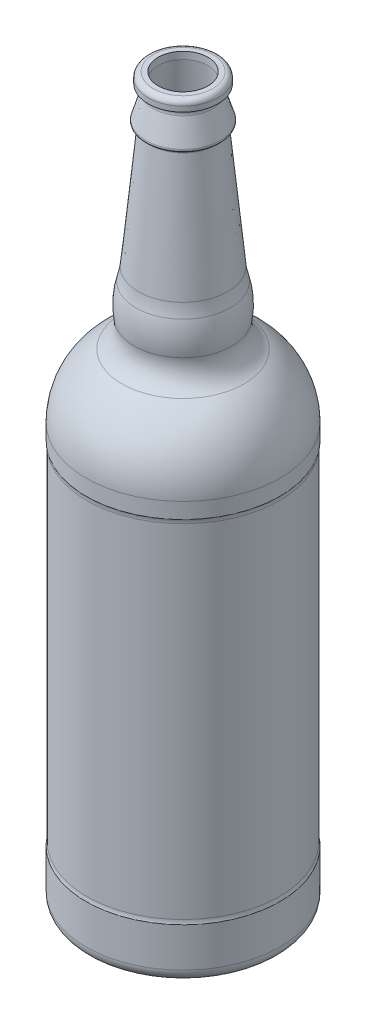
ISO-10303-21;
HEADER;
FILE_DESCRIPTION(('STEP AP214'),'2;1');
FILE_NAME('part.step','',(''),(''),'','','');
FILE_SCHEMA(('AUTOMOTIVE_DESIGN { 1 0 10303 214 1 1 1 1 }'));
ENDSEC;
DATA;
#1=APPLICATION_CONTEXT('core data for automotive mechanical design processes');
#2=APPLICATION_PROTOCOL_DEFINITION('international standard','automotive_design',2000,#1);
#3=PRODUCT_CONTEXT('',#1,'mechanical');
#4=PRODUCT('Part','Part','',(#3));
#5=PRODUCT_RELATED_PRODUCT_CATEGORY('part','',(#4));
#6=PRODUCT_DEFINITION_FORMATION('','',#4);
#7=PRODUCT_DEFINITION_CONTEXT('part definition',#1,'design');
#8=PRODUCT_DEFINITION('design','',#6,#7);
#9=PRODUCT_DEFINITION_SHAPE('','',#8);
#10=(LENGTH_UNIT() NAMED_UNIT(*) SI_UNIT(.MILLI.,.METRE.));
#11=(NAMED_UNIT(*) PLANE_ANGLE_UNIT() SI_UNIT($,.RADIAN.));
#12=(NAMED_UNIT(*) SI_UNIT($,.STERADIAN.) SOLID_ANGLE_UNIT());
#13=UNCERTAINTY_MEASURE_WITH_UNIT(LENGTH_MEASURE(1.E-05),#10,'distance_accuracy_value','');
#14=(GEOMETRIC_REPRESENTATION_CONTEXT(3) GLOBAL_UNCERTAINTY_ASSIGNED_CONTEXT((#13)) GLOBAL_UNIT_ASSIGNED_CONTEXT((#10,
#11,#12)) REPRESENTATION_CONTEXT('',''));
#15=CARTESIAN_POINT('',(0.,0.,0.));
#16=DIRECTION('',(0.,0.,1.));
#17=DIRECTION('',(1.,0.,0.));
#18=AXIS2_PLACEMENT_3D('',#15,#16,#17);
#19=CARTESIAN_POINT('',(0.,-154.672342519668,0.));
#20=DIRECTION('',(0.,-1.,0.));
#21=DIRECTION('',(-1.,0.,0.));
#22=AXIS2_PLACEMENT_3D('',#19,#20,#21);
#23=SPHERICAL_SURFACE('',#22,157.847342519668);
#24=CARTESIAN_POINT('',(0.,0.0974839365159184,0.));
#25=DIRECTION('',(0.,-1.,0.));
#26=DIRECTION('',(0.,0.,-1.));
#27=AXIS2_PLACEMENT_3D('',#24,#25,#26);
#28=CIRCLE('',#27,31.0174847343261);
#29=CARTESIAN_POINT('',(0.,0.0974839365159184,-31.0174847343261));
#30=VERTEX_POINT('',#29);
#31=EDGE_CURVE('E130',#30,#30,#28,.T.);
#32=ORIENTED_EDGE('',*,*,#31,.T.);
#33=EDGE_LOOP('',(#32));
#34=FACE_BOUND('',#33,.T.);
#35=ADVANCED_FACE('F33',(#34),#23,.F.);
#36=CARTESIAN_POINT('',(0.,-154.672342519668,0.));
#37=DIRECTION('',(0.,-1.,0.));
#38=DIRECTION('',(1.,0.,0.));
#39=AXIS2_PLACEMENT_3D('',#36,#37,#38);
#40=SPHERICAL_SURFACE('',#39,159.347342519668);
#41=CARTESIAN_POINT('',(0.,1.56823875556095,0.));
#42=DIRECTION('',(0.,-1.,0.));
#43=DIRECTION('',(0.,0.,-1.));
#44=AXIS2_PLACEMENT_3D('',#41,#42,#43);
#45=CIRCLE('',#44,31.3122393140282);
#46=CARTESIAN_POINT('',(0.,1.56823875556095,-31.3122393140282));
#47=VERTEX_POINT('',#46);
#48=EDGE_CURVE('E10',#47,#47,#45,.T.);
#49=ORIENTED_EDGE('',*,*,#48,.F.);
#50=EDGE_LOOP('',(#49));
#51=FACE_BOUND('',#50,.T.);
#52=ADVANCED_FACE('F147',(#51),#40,.T.);
#53=CARTESIAN_POINT('',(0.,5.,0.));
#54=DIRECTION('',(0.,-1.,0.));
#55=DIRECTION('',(0.,0.,-1.));
#56=AXIS2_PLACEMENT_3D('',#53,#54,#55);
#57=TOROIDAL_SURFACE('',#56,32.,3.50000000000025);
#58=ORIENTED_EDGE('',*,*,#48,.T.);
#59=EDGE_LOOP('',(#58));
#60=FACE_BOUND('',#59,.T.);
#61=CARTESIAN_POINT('',(0.,5.,0.));
#62=DIRECTION('',(0.,-1.,0.));
#63=DIRECTION('',(0.,0.,-1.));
#64=AXIS2_PLACEMENT_3D('',#61,#62,#63);
#65=CIRCLE('',#64,35.5000000000003);
#66=CARTESIAN_POINT('',(0.,5.,-35.5000000000003));
#67=VERTEX_POINT('',#66);
#68=EDGE_CURVE('E39',#67,#67,#65,.T.);
#69=ORIENTED_EDGE('',*,*,#68,.F.);
#70=EDGE_LOOP('',(#69));
#71=FACE_BOUND('',#70,.T.);
#72=ADVANCED_FACE('F151',(#60,#71),#57,.F.);
#73=CARTESIAN_POINT('',(0.,0.,0.));
#74=DIRECTION('',(0.,-1.,0.));
#75=DIRECTION('',(0.,0.,-1.));
#76=AXIS2_PLACEMENT_3D('',#73,#74,#75);
#77=CYLINDRICAL_SURFACE('',#76,35.5000000000001);
#78=ORIENTED_EDGE('',*,*,#68,.T.);
#79=EDGE_LOOP('',(#78));
#80=FACE_BOUND('',#79,.T.);
#81=CARTESIAN_POINT('',(0.,19.7758923924639,0.));
#82=DIRECTION('',(0.,-1.,0.));
#83=DIRECTION('',(0.,0.,-1.));
#84=AXIS2_PLACEMENT_3D('',#81,#82,#83);
#85=CIRCLE('',#84,35.5);
#86=CARTESIAN_POINT('',(0.,19.7758923924639,-35.5));
#87=VERTEX_POINT('',#86);
#88=EDGE_CURVE('E43',#87,#87,#85,.T.);
#89=ORIENTED_EDGE('',*,*,#88,.F.);
#90=EDGE_LOOP('',(#89));
#91=FACE_BOUND('',#90,.T.);
#92=ADVANCED_FACE('F156',(#80,#91),#77,.F.);
#93=CARTESIAN_POINT('',(0.,21.5612494995996,0.));
#94=DIRECTION('',(0.,-1.,0.));
#95=DIRECTION('',(0.,0.,-1.));
#96=AXIS2_PLACEMENT_3D('',#93,#94,#95);
#97=TOROIDAL_SURFACE('',#96,41.75,6.5);
#98=ORIENTED_EDGE('',*,*,#88,.T.);
#99=EDGE_LOOP('',(#98));
#100=FACE_BOUND('',#99,.T.);
#101=CARTESIAN_POINT('',(0.,21.5612494995996,0.));
#102=DIRECTION('',(0.,-1.,0.));
#103=DIRECTION('',(0.,0.,-1.));
#104=AXIS2_PLACEMENT_3D('',#101,#102,#103);
#105=CIRCLE('',#104,35.25);
#106=CARTESIAN_POINT('',(0.,21.5612494995996,-35.25));
#107=VERTEX_POINT('',#106);
#108=EDGE_CURVE('E47',#107,#107,#105,.T.);
#109=ORIENTED_EDGE('',*,*,#108,.F.);
#110=EDGE_LOOP('',(#109));
#111=FACE_BOUND('',#110,.T.);
#112=ADVANCED_FACE('F161',(#100,#111),#97,.T.);
#113=CARTESIAN_POINT('',(0.,0.,0.));
#114=DIRECTION('',(0.,-1.,0.));
#115=DIRECTION('',(0.,0.,-1.));
#116=AXIS2_PLACEMENT_3D('',#113,#114,#115);
#117=CYLINDRICAL_SURFACE('',#116,35.25);
#118=ORIENTED_EDGE('',*,*,#108,.T.);
#119=EDGE_LOOP('',(#118));
#120=FACE_BOUND('',#119,.T.);
#121=CARTESIAN_POINT('',(0.,152.4387505004,0.));
#122=DIRECTION('',(0.,-1.,0.));
#123=DIRECTION('',(0.,0.,-1.));
#124=AXIS2_PLACEMENT_3D('',#121,#122,#123);
#125=CIRCLE('',#124,35.25);
#126=CARTESIAN_POINT('',(0.,152.4387505004,-35.25));
#127=VERTEX_POINT('',#126);
#128=EDGE_CURVE('E52',#127,#127,#125,.T.);
#129=ORIENTED_EDGE('',*,*,#128,.F.);
#130=EDGE_LOOP('',(#129));
#131=FACE_BOUND('',#130,.T.);
#132=ADVANCED_FACE('F164',(#120,#131),#117,.F.);
#133=CARTESIAN_POINT('',(0.,152.4387505004,0.));
#134=DIRECTION('',(0.,-1.,0.));
#135=DIRECTION('',(0.,0.,-1.));
#136=AXIS2_PLACEMENT_3D('',#133,#134,#135);
#137=TOROIDAL_SURFACE('',#136,41.75,6.5);
#138=ORIENTED_EDGE('',*,*,#128,.T.);
#139=EDGE_LOOP('',(#138));
#140=FACE_BOUND('',#139,.T.);
#141=CARTESIAN_POINT('',(0.,154.224107607536,0.));
#142=DIRECTION('',(0.,-1.,0.));
#143=DIRECTION('',(0.,0.,-1.));
#144=AXIS2_PLACEMENT_3D('',#141,#142,#143);
#145=CIRCLE('',#144,35.5);
#146=CARTESIAN_POINT('',(0.,154.224107607536,-35.5));
#147=VERTEX_POINT('',#146);
#148=EDGE_CURVE('E55',#147,#147,#145,.T.);
#149=ORIENTED_EDGE('',*,*,#148,.F.);
#150=EDGE_LOOP('',(#149));
#151=FACE_BOUND('',#150,.T.);
#152=ADVANCED_FACE('F168',(#140,#151),#137,.T.);
#153=CARTESIAN_POINT('',(0.,0.,0.));
#154=DIRECTION('',(0.,-1.,0.));
#155=DIRECTION('',(0.,0.,-1.));
#156=AXIS2_PLACEMENT_3D('',#153,#154,#155);
#157=CYLINDRICAL_SURFACE('',#156,35.5);
#158=ORIENTED_EDGE('',*,*,#148,.T.);
#159=EDGE_LOOP('',(#158));
#160=FACE_BOUND('',#159,.T.);
#161=CARTESIAN_POINT('',(0.,160.,0.));
#162=DIRECTION('',(0.,-1.,0.));
#163=DIRECTION('',(0.,0.,-1.));
#164=AXIS2_PLACEMENT_3D('',#161,#162,#163);
#165=CIRCLE('',#164,35.5);
#166=CARTESIAN_POINT('',(0.,160.,-35.5));
#167=VERTEX_POINT('',#166);
#168=EDGE_CURVE('E58',#167,#167,#165,.T.);
#169=ORIENTED_EDGE('',*,*,#168,.F.);
#170=EDGE_LOOP('',(#169));
#171=FACE_BOUND('',#170,.T.);
#172=ADVANCED_FACE('F172',(#160,#171),#157,.F.);
#173=CARTESIAN_POINT('',(0.,160.,0.));
#174=DIRECTION('',(0.,-1.,0.));
#175=DIRECTION('',(0.,0.,-1.));
#176=AXIS2_PLACEMENT_3D('',#173,#174,#175);
#177=DEGENERATE_TOROIDAL_SURFACE('',#176,8.5,27.,.T.);
#178=ORIENTED_EDGE('',*,*,#168,.T.);
#179=EDGE_LOOP('',(#178));
#180=FACE_BOUND('',#179,.T.);
#181=CARTESIAN_POINT('',(0.,183.071021924109,0.));
#182=DIRECTION('',(0.,-1.,0.));
#183=DIRECTION('',(0.,0.,-1.));
#184=AXIS2_PLACEMENT_3D('',#181,#182,#183);
#185=CIRCLE('',#184,22.525974025974);
#186=CARTESIAN_POINT('',(0.,183.071021924109,-22.525974025974));
#187=VERTEX_POINT('',#186);
#188=EDGE_CURVE('E61',#187,#187,#185,.T.);
#189=ORIENTED_EDGE('',*,*,#188,.F.);
#190=EDGE_LOOP('',(#189));
#191=FACE_BOUND('',#190,.T.);
#192=ADVANCED_FACE('F176',(#180,#191),#177,.F.);
#193=CARTESIAN_POINT('',(0.,192.897568299192,0.));
#194=DIRECTION('',(0.,-1.,0.));
#195=DIRECTION('',(0.,0.,-1.));
#196=AXIS2_PLACEMENT_3D('',#193,#194,#195);
#197=TOROIDAL_SURFACE('',#196,28.5,11.5);
#198=ORIENTED_EDGE('',*,*,#188,.T.);
#199=EDGE_LOOP('',(#198));
#200=FACE_BOUND('',#199,.T.);
#201=CARTESIAN_POINT('',(0.,194.744933806774,0.));
#202=DIRECTION('',(0.,-1.,0.));
#203=DIRECTION('',(0.,0.,-1.));
#204=AXIS2_PLACEMENT_3D('',#201,#202,#203);
#205=CIRCLE('',#204,17.1493506493506);
#206=CARTESIAN_POINT('',(0.,194.744933806774,-17.1493506493506));
#207=VERTEX_POINT('',#206);
#208=EDGE_CURVE('E64',#207,#207,#205,.T.);
#209=ORIENTED_EDGE('',*,*,#208,.F.);
#210=EDGE_LOOP('',(#209));
#211=FACE_BOUND('',#210,.T.);
#212=ADVANCED_FACE('F180',(#200,#211),#197,.T.);
#213=CARTESIAN_POINT('',(0.,199.082226737618,0.));
#214=DIRECTION('',(0.,-1.,0.));
#215=DIRECTION('',(0.,0.,-1.));
#216=AXIS2_PLACEMENT_3D('',#213,#214,#215);
#217=DEGENERATE_TOROIDAL_SURFACE('',#216,9.5,27.,.F.);
#218=ORIENTED_EDGE('',*,*,#208,.T.);
#219=EDGE_LOOP('',(#218));
#220=FACE_BOUND('',#219,.T.);
#221=CARTESIAN_POINT('',(0.,206.373679990531,0.));
#222=DIRECTION('',(0.,-1.,0.));
#223=DIRECTION('',(0.,0.,-1.));
#224=AXIS2_PLACEMENT_3D('',#221,#222,#223);
#225=CIRCLE('',#224,16.4968211414509);
#226=CARTESIAN_POINT('',(0.,206.373679990531,-16.4968211414509));
#227=VERTEX_POINT('',#226);
#228=EDGE_CURVE('E67',#227,#227,#225,.T.);
#229=ORIENTED_EDGE('',*,*,#228,.F.);
#230=EDGE_LOOP('',(#229));
#231=FACE_BOUND('',#230,.T.);
#232=ADVANCED_FACE('F184',(#220,#231),#217,.T.);
#233=CARTESIAN_POINT('',(0.,214.47529471599,0.));
#234=DIRECTION('',(0.,-1.,0.));
#235=DIRECTION('',(0.,0.,-1.));
#236=AXIS2_PLACEMENT_3D('',#233,#234,#235);
#237=TOROIDAL_SURFACE('',#236,45.3821779652852,30.);
#238=ORIENTED_EDGE('',*,*,#228,.T.);
#239=EDGE_LOOP('',(#238));
#240=FACE_BOUND('',#239,.T.);
#241=CARTESIAN_POINT('',(0.,211.5600982231,0.));
#242=DIRECTION('',(0.,-1.,0.));
#243=DIRECTION('',(0.,0.,-1.));
#244=AXIS2_PLACEMENT_3D('',#241,#242,#243);
#245=CIRCLE('',#244,15.524153425677);
#246=CARTESIAN_POINT('',(0.,211.5600982231,-15.524153425677));
#247=VERTEX_POINT('',#246);
#248=EDGE_CURVE('E70',#247,#247,#245,.T.);
#249=ORIENTED_EDGE('',*,*,#248,.F.);
#250=EDGE_LOOP('',(#249));
#251=FACE_BOUND('',#250,.T.);
#252=ADVANCED_FACE('F188',(#240,#251),#237,.T.);
#253=CARTESIAN_POINT('',(0.,273.26068041471,0.));
#254=DIRECTION('',(0.,-1.,0.));
#255=DIRECTION('',(0.,0.,-1.));
#256=AXIS2_PLACEMENT_3D('',#253,#254,#255);
#257=CONICAL_SURFACE('',#256,9.5,0.0973267984467198);
#258=ORIENTED_EDGE('',*,*,#248,.T.);
#259=EDGE_LOOP('',(#258));
#260=FACE_BOUND('',#259,.T.);
#261=CARTESIAN_POINT('',(0.,273.26068041471,0.));
#262=DIRECTION('',(0.,-1.,0.));
#263=DIRECTION('',(0.,0.,-1.));
#264=AXIS2_PLACEMENT_3D('',#261,#262,#263);
#265=CIRCLE('',#264,9.5);
#266=CARTESIAN_POINT('',(0.,273.26068041471,-9.5));
#267=VERTEX_POINT('',#266);
#268=EDGE_CURVE('E73',#267,#267,#265,.T.);
#269=ORIENTED_EDGE('',*,*,#268,.F.);
#270=EDGE_LOOP('',(#269));
#271=FACE_BOUND('',#270,.T.);
#272=ADVANCED_FACE('F192',(#260,#271),#257,.F.);
#273=CARTESIAN_POINT('',(0.,0.,0.));
#274=DIRECTION('',(0.,-1.,0.));
#275=DIRECTION('',(0.,0.,-1.));
#276=AXIS2_PLACEMENT_3D('',#273,#274,#275);
#277=CYLINDRICAL_SURFACE('',#276,9.5);
#278=ORIENTED_EDGE('',*,*,#268,.T.);
#279=EDGE_LOOP('',(#278));
#280=FACE_BOUND('',#279,.T.);
#281=CARTESIAN_POINT('',(0.,276.,0.));
#282=DIRECTION('',(0.,-1.,0.));
#283=DIRECTION('',(0.,0.,-1.));
#284=AXIS2_PLACEMENT_3D('',#281,#282,#283);
#285=CIRCLE('',#284,9.5);
#286=CARTESIAN_POINT('',(0.,276.,-9.5));
#287=VERTEX_POINT('',#286);
#288=EDGE_CURVE('E76',#287,#287,#285,.T.);
#289=ORIENTED_EDGE('',*,*,#288,.F.);
#290=EDGE_LOOP('',(#289));
#291=FACE_BOUND('',#290,.T.);
#292=ADVANCED_FACE('F196',(#280,#291),#277,.F.);
#293=CARTESIAN_POINT('',(11.335,276.,0.));
#294=DIRECTION('',(0.,1.,0.));
#295=DIRECTION('',(0.,0.,1.));
#296=AXIS2_PLACEMENT_3D('',#293,#294,#295);
#297=PLANE('',#296);
#298=ORIENTED_EDGE('',*,*,#288,.T.);
#299=EDGE_LOOP('',(#298));
#300=FACE_BOUND('',#299,.T.);
#301=CARTESIAN_POINT('',(0.,276.,0.));
#302=DIRECTION('',(0.,-1.,0.));
#303=DIRECTION('',(0.,0.,-1.));
#304=AXIS2_PLACEMENT_3D('',#301,#302,#303);
#305=CIRCLE('',#304,11.335);
#306=CARTESIAN_POINT('',(0.,276.,-11.335));
#307=VERTEX_POINT('',#306);
#308=EDGE_CURVE('E79',#307,#307,#305,.T.);
#309=ORIENTED_EDGE('',*,*,#308,.F.);
#310=EDGE_LOOP('',(#309));
#311=FACE_BOUND('',#310,.T.);
#312=ADVANCED_FACE('F200',(#300,#311),#297,.T.);
#313=CARTESIAN_POINT('',(0.,274.,0.));
#314=DIRECTION('',(0.,-1.,0.));
#315=DIRECTION('',(0.,0.,-1.));
#316=AXIS2_PLACEMENT_3D('',#313,#314,#315);
#317=TOROIDAL_SURFACE('',#316,11.335,2.);
#318=ORIENTED_EDGE('',*,*,#308,.T.);
#319=EDGE_LOOP('',(#318));
#320=FACE_BOUND('',#319,.T.);
#321=CARTESIAN_POINT('',(0.,274.,0.));
#322=DIRECTION('',(0.,-1.,0.));
#323=DIRECTION('',(0.,0.,-1.));
#324=AXIS2_PLACEMENT_3D('',#321,#322,#323);
#325=CIRCLE('',#324,13.335);
#326=CARTESIAN_POINT('',(0.,274.,-13.335));
#327=VERTEX_POINT('',#326);
#328=EDGE_CURVE('E82',#327,#327,#325,.T.);
#329=ORIENTED_EDGE('',*,*,#328,.F.);
#330=EDGE_LOOP('',(#329));
#331=FACE_BOUND('',#330,.T.);
#332=ADVANCED_FACE('F204',(#320,#331),#317,.T.);
#333=CARTESIAN_POINT('',(0.,0.,0.));
#334=DIRECTION('',(0.,-1.,0.));
#335=DIRECTION('',(0.,0.,-1.));
#336=AXIS2_PLACEMENT_3D('',#333,#334,#335);
#337=CYLINDRICAL_SURFACE('',#336,13.335);
#338=ORIENTED_EDGE('',*,*,#328,.T.);
#339=EDGE_LOOP('',(#338));
#340=FACE_BOUND('',#339,.T.);
#341=CARTESIAN_POINT('',(0.,272.,0.));
#342=DIRECTION('',(0.,-1.,0.));
#343=DIRECTION('',(0.,0.,-1.));
#344=AXIS2_PLACEMENT_3D('',#341,#342,#343);
#345=CIRCLE('',#344,13.335);
#346=CARTESIAN_POINT('',(0.,272.,-13.335));
#347=VERTEX_POINT('',#346);
#348=EDGE_CURVE('E85',#347,#347,#345,.T.);
#349=ORIENTED_EDGE('',*,*,#348,.F.);
#350=EDGE_LOOP('',(#349));
#351=FACE_BOUND('',#350,.T.);
#352=ADVANCED_FACE('F208',(#340,#351),#337,.T.);
#353=CARTESIAN_POINT('',(0.,270.,0.));
#354=DIRECTION('',(0.,-1.,0.));
#355=DIRECTION('',(0.,0.,-1.));
#356=AXIS2_PLACEMENT_3D('',#353,#354,#355);
#357=TOROIDAL_SURFACE('',#356,13.335,2.);
#358=ORIENTED_EDGE('',*,*,#348,.T.);
#359=EDGE_LOOP('',(#358));
#360=FACE_BOUND('',#359,.T.);
#361=CARTESIAN_POINT('',(0.,269.421250191654,0.));
#362=DIRECTION('',(0.,-1.,0.));
#363=DIRECTION('',(0.,0.,-1.));
#364=AXIS2_PLACEMENT_3D('',#361,#362,#363);
#365=CIRCLE('',#364,11.4205683194903);
#366=CARTESIAN_POINT('',(0.,269.421250191654,-11.4205683194903));
#367=VERTEX_POINT('',#366);
#368=EDGE_CURVE('E88',#367,#367,#365,.T.);
#369=ORIENTED_EDGE('',*,*,#368,.F.);
#370=EDGE_LOOP('',(#369));
#371=FACE_BOUND('',#370,.T.);
#372=ADVANCED_FACE('F212',(#360,#371),#357,.F.);
#373=CARTESIAN_POINT('',(0.,260.289374904173,0.));
#374=DIRECTION('',(0.,-1.,0.));
#375=DIRECTION('',(0.,0.,-1.));
#376=AXIS2_PLACEMENT_3D('',#373,#374,#375);
#377=CONICAL_SURFACE('',#376,14.1812158402548,0.293573737831604);
#378=ORIENTED_EDGE('',*,*,#368,.T.);
#379=EDGE_LOOP('',(#378));
#380=FACE_BOUND('',#379,.T.);
#381=CARTESIAN_POINT('',(0.,260.289374904173,0.));
#382=DIRECTION('',(0.,-1.,0.));
#383=DIRECTION('',(0.,0.,-1.));
#384=AXIS2_PLACEMENT_3D('',#381,#382,#383);
#385=CIRCLE('',#384,14.1812158402548);
#386=CARTESIAN_POINT('',(0.,260.289374904173,-14.1812158402548));
#387=VERTEX_POINT('',#386);
#388=EDGE_CURVE('E91',#387,#387,#385,.T.);
#389=ORIENTED_EDGE('',*,*,#388,.F.);
#390=EDGE_LOOP('',(#389));
#391=FACE_BOUND('',#390,.T.);
#392=ADVANCED_FACE('F216',(#380,#391),#377,.T.);
#393=CARTESIAN_POINT('',(0.,260.,0.));
#394=DIRECTION('',(0.,-1.,0.));
#395=DIRECTION('',(0.,0.,-1.));
#396=AXIS2_PLACEMENT_3D('',#393,#394,#395);
#397=TOROIDAL_SURFACE('',#396,13.224,0.99999999999998);
#398=ORIENTED_EDGE('',*,*,#388,.T.);
#399=EDGE_LOOP('',(#398));
#400=FACE_BOUND('',#399,.T.);
#401=CARTESIAN_POINT('',(0.,259.009567771122,0.));
#402=DIRECTION('',(0.,-1.,0.));
#403=DIRECTION('',(0.,0.,-1.));
#404=AXIS2_PLACEMENT_3D('',#401,#402,#403);
#405=CIRCLE('',#404,13.362);
#406=CARTESIAN_POINT('',(0.,259.009567771122,-13.362));
#407=VERTEX_POINT('',#406);
#408=EDGE_CURVE('E94',#407,#407,#405,.T.);
#409=ORIENTED_EDGE('',*,*,#408,.F.);
#410=EDGE_LOOP('',(#409));
#411=FACE_BOUND('',#410,.T.);
#412=ADVANCED_FACE('F220',(#400,#411),#397,.T.);
#413=CARTESIAN_POINT('',(0.,258.019135542244,0.));
#414=DIRECTION('',(0.,-1.,0.));
#415=DIRECTION('',(0.,0.,-1.));
#416=AXIS2_PLACEMENT_3D('',#413,#414,#415);
#417=TOROIDAL_SURFACE('',#416,13.5,1.00000000000001);
#418=ORIENTED_EDGE('',*,*,#408,.T.);
#419=EDGE_LOOP('',(#418));
#420=FACE_BOUND('',#419,.T.);
#421=CARTESIAN_POINT('',(0.,257.921962325815,0.));
#422=DIRECTION('',(0.,-1.,0.));
#423=DIRECTION('',(0.,0.,-1.));
#424=AXIS2_PLACEMENT_3D('',#421,#422,#423);
#425=CIRCLE('',#424,12.5047325153464);
#426=CARTESIAN_POINT('',(0.,257.921962325815,-12.5047325153464));
#427=VERTEX_POINT('',#426);
#428=EDGE_CURVE('E97',#427,#427,#425,.T.);
#429=ORIENTED_EDGE('',*,*,#428,.F.);
#430=EDGE_LOOP('',(#429));
#431=FACE_BOUND('',#430,.T.);
#432=ADVANCED_FACE('F224',(#420,#431),#417,.F.);
#433=CARTESIAN_POINT('',(0.,211.705858047745,0.));
#434=DIRECTION('',(0.,-1.,0.));
#435=DIRECTION('',(0.,0.,-1.));
#436=AXIS2_PLACEMENT_3D('',#433,#434,#435);
#437=CONICAL_SURFACE('',#436,17.0170546526574,0.0973267984467198);
#438=ORIENTED_EDGE('',*,*,#428,.T.);
#439=EDGE_LOOP('',(#438));
#440=FACE_BOUND('',#439,.T.);
#441=CARTESIAN_POINT('',(0.,211.705858047745,0.));
#442=DIRECTION('',(0.,-1.,0.));
#443=DIRECTION('',(0.,0.,-1.));
#444=AXIS2_PLACEMENT_3D('',#441,#442,#443);
#445=CIRCLE('',#444,17.0170546526574);
#446=CARTESIAN_POINT('',(0.,211.705858047745,-17.0170546526574));
#447=VERTEX_POINT('',#446);
#448=EDGE_CURVE('E100',#447,#447,#445,.T.);
#449=ORIENTED_EDGE('',*,*,#448,.F.);
#450=EDGE_LOOP('',(#449));
#451=FACE_BOUND('',#450,.T.);
#452=ADVANCED_FACE('F228',(#440,#451),#437,.T.);
#453=CARTESIAN_POINT('',(0.,214.47529471599,0.));
#454=DIRECTION('',(0.,-1.,0.));
#455=DIRECTION('',(0.,0.,-1.));
#456=AXIS2_PLACEMENT_3D('',#453,#454,#455);
#457=TOROIDAL_SURFACE('',#456,45.3821779652852,28.5);
#458=ORIENTED_EDGE('',*,*,#448,.T.);
#459=EDGE_LOOP('',(#458));
#460=FACE_BOUND('',#459,.T.);
#461=CARTESIAN_POINT('',(0.,206.778760726804,0.));
#462=DIRECTION('',(0.,-1.,0.));
#463=DIRECTION('',(0.,0.,-1.));
#464=AXIS2_PLACEMENT_3D('',#461,#462,#463);
#465=CIRCLE('',#464,17.9410889826426);
#466=CARTESIAN_POINT('',(0.,206.778760726804,-17.9410889826426));
#467=VERTEX_POINT('',#466);
#468=EDGE_CURVE('E103',#467,#467,#465,.T.);
#469=ORIENTED_EDGE('',*,*,#468,.F.);
#470=EDGE_LOOP('',(#469));
#471=FACE_BOUND('',#470,.T.);
#472=ADVANCED_FACE('F232',(#460,#471),#457,.F.);
#473=CARTESIAN_POINT('',(0.,199.082226737618,0.));
#474=DIRECTION('',(0.,-1.,0.));
#475=DIRECTION('',(0.,0.,-1.));
#476=AXIS2_PLACEMENT_3D('',#473,#474,#475);
#477=DEGENERATE_TOROIDAL_SURFACE('',#476,9.5,28.5,.F.);
#478=ORIENTED_EDGE('',*,*,#468,.T.);
#479=EDGE_LOOP('',(#478));
#480=FACE_BOUND('',#479,.T.);
#481=CARTESIAN_POINT('',(0.,194.503973088394,0.));
#482=DIRECTION('',(0.,-1.,0.));
#483=DIRECTION('',(0.,0.,-1.));
#484=AXIS2_PLACEMENT_3D('',#481,#482,#483);
#485=CIRCLE('',#484,18.6298701298701);
#486=CARTESIAN_POINT('',(0.,194.503973088394,-18.6298701298701));
#487=VERTEX_POINT('',#486);
#488=EDGE_CURVE('E106',#487,#487,#485,.T.);
#489=ORIENTED_EDGE('',*,*,#488,.F.);
#490=EDGE_LOOP('',(#489));
#491=FACE_BOUND('',#490,.T.);
#492=ADVANCED_FACE('F236',(#480,#491),#477,.F.);
#493=CARTESIAN_POINT('',(0.,192.897568299192,0.));
#494=DIRECTION('',(0.,-1.,0.));
#495=DIRECTION('',(0.,0.,-1.));
#496=AXIS2_PLACEMENT_3D('',#493,#494,#495);
#497=TOROIDAL_SURFACE('',#496,28.5,9.99999999999999);
#498=ORIENTED_EDGE('',*,*,#488,.T.);
#499=EDGE_LOOP('',(#498));
#500=FACE_BOUND('',#499,.T.);
#501=CARTESIAN_POINT('',(0.,184.352745364337,0.));
#502=DIRECTION('',(0.,-1.,0.));
#503=DIRECTION('',(0.,0.,-1.));
#504=AXIS2_PLACEMENT_3D('',#501,#502,#503);
#505=CIRCLE('',#504,23.3051948051948);
#506=CARTESIAN_POINT('',(0.,184.352745364337,-23.3051948051948));
#507=VERTEX_POINT('',#506);
#508=EDGE_CURVE('E109',#507,#507,#505,.T.);
#509=ORIENTED_EDGE('',*,*,#508,.F.);
#510=EDGE_LOOP('',(#509));
#511=FACE_BOUND('',#510,.T.);
#512=ADVANCED_FACE('F240',(#500,#511),#497,.F.);
#513=CARTESIAN_POINT('',(0.,160.,0.));
#514=DIRECTION('',(0.,-1.,0.));
#515=DIRECTION('',(0.,0.,-1.));
#516=AXIS2_PLACEMENT_3D('',#513,#514,#515);
#517=DEGENERATE_TOROIDAL_SURFACE('',#516,8.5,28.5,.T.);
#518=ORIENTED_EDGE('',*,*,#508,.T.);
#519=EDGE_LOOP('',(#518));
#520=FACE_BOUND('',#519,.T.);
#521=CARTESIAN_POINT('',(0.,160.,0.));
#522=DIRECTION('',(0.,-1.,0.));
#523=DIRECTION('',(0.,0.,-1.));
#524=AXIS2_PLACEMENT_3D('',#521,#522,#523);
#525=CIRCLE('',#524,37.);
#526=CARTESIAN_POINT('',(0.,160.,-37.));
#527=VERTEX_POINT('',#526);
#528=EDGE_CURVE('E112',#527,#527,#525,.T.);
#529=ORIENTED_EDGE('',*,*,#528,.F.);
#530=EDGE_LOOP('',(#529));
#531=FACE_BOUND('',#530,.T.);
#532=ADVANCED_FACE('F244',(#520,#531),#517,.T.);
#533=CARTESIAN_POINT('',(0.,0.,0.));
#534=DIRECTION('',(0.,-1.,0.));
#535=DIRECTION('',(0.,0.,-1.));
#536=AXIS2_PLACEMENT_3D('',#533,#534,#535);
#537=CYLINDRICAL_SURFACE('',#536,37.);
#538=ORIENTED_EDGE('',*,*,#528,.T.);
#539=EDGE_LOOP('',(#538));
#540=FACE_BOUND('',#539,.T.);
#541=CARTESIAN_POINT('',(0.,154.,0.));
#542=DIRECTION('',(0.,-1.,0.));
#543=DIRECTION('',(0.,0.,-1.));
#544=AXIS2_PLACEMENT_3D('',#541,#542,#543);
#545=CIRCLE('',#544,37.);
#546=CARTESIAN_POINT('',(0.,154.,-37.));
#547=VERTEX_POINT('',#546);
#548=EDGE_CURVE('E115',#547,#547,#545,.T.);
#549=ORIENTED_EDGE('',*,*,#548,.F.);
#550=EDGE_LOOP('',(#549));
#551=FACE_BOUND('',#550,.T.);
#552=ADVANCED_FACE('F248',(#540,#551),#537,.T.);
#553=CARTESIAN_POINT('',(0.,152.4387505004,0.));
#554=DIRECTION('',(0.,-1.,0.));
#555=DIRECTION('',(0.,0.,-1.));
#556=AXIS2_PLACEMENT_3D('',#553,#554,#555);
#557=TOROIDAL_SURFACE('',#556,41.75,5.);
#558=ORIENTED_EDGE('',*,*,#548,.T.);
#559=EDGE_LOOP('',(#558));
#560=FACE_BOUND('',#559,.T.);
#561=CARTESIAN_POINT('',(0.,152.4387505004,0.));
#562=DIRECTION('',(0.,-1.,0.));
#563=DIRECTION('',(0.,0.,-1.));
#564=AXIS2_PLACEMENT_3D('',#561,#562,#563);
#565=CIRCLE('',#564,36.75);
#566=CARTESIAN_POINT('',(0.,152.4387505004,-36.75));
#567=VERTEX_POINT('',#566);
#568=EDGE_CURVE('E118',#567,#567,#565,.T.);
#569=ORIENTED_EDGE('',*,*,#568,.F.);
#570=EDGE_LOOP('',(#569));
#571=FACE_BOUND('',#570,.T.);
#572=ADVANCED_FACE('F252',(#560,#571),#557,.F.);
#573=CARTESIAN_POINT('',(0.,0.,0.));
#574=DIRECTION('',(0.,-1.,0.));
#575=DIRECTION('',(0.,0.,-1.));
#576=AXIS2_PLACEMENT_3D('',#573,#574,#575);
#577=CYLINDRICAL_SURFACE('',#576,36.75);
#578=ORIENTED_EDGE('',*,*,#568,.T.);
#579=EDGE_LOOP('',(#578));
#580=FACE_BOUND('',#579,.T.);
#581=CARTESIAN_POINT('',(0.,21.5612494995996,0.));
#582=DIRECTION('',(0.,-1.,0.));
#583=DIRECTION('',(0.,0.,-1.));
#584=AXIS2_PLACEMENT_3D('',#581,#582,#583);
#585=CIRCLE('',#584,36.75);
#586=CARTESIAN_POINT('',(0.,21.5612494995996,-36.75));
#587=VERTEX_POINT('',#586);
#588=EDGE_CURVE('E121',#587,#587,#585,.T.);
#589=ORIENTED_EDGE('',*,*,#588,.F.);
#590=EDGE_LOOP('',(#589));
#591=FACE_BOUND('',#590,.T.);
#592=ADVANCED_FACE('F256',(#580,#591),#577,.T.);
#593=CARTESIAN_POINT('',(0.,21.5612494995996,0.));
#594=DIRECTION('',(0.,-1.,0.));
#595=DIRECTION('',(0.,0.,-1.));
#596=AXIS2_PLACEMENT_3D('',#593,#594,#595);
#597=TOROIDAL_SURFACE('',#596,41.75,4.99999999999999);
#598=ORIENTED_EDGE('',*,*,#588,.T.);
#599=EDGE_LOOP('',(#598));
#600=FACE_BOUND('',#599,.T.);
#601=CARTESIAN_POINT('',(0.,20.,0.));
#602=DIRECTION('',(0.,-1.,0.));
#603=DIRECTION('',(0.,0.,-1.));
#604=AXIS2_PLACEMENT_3D('',#601,#602,#603);
#605=CIRCLE('',#604,37.);
#606=CARTESIAN_POINT('',(0.,20.,-37.));
#607=VERTEX_POINT('',#606);
#608=EDGE_CURVE('E124',#607,#607,#605,.T.);
#609=ORIENTED_EDGE('',*,*,#608,.F.);
#610=EDGE_LOOP('',(#609));
#611=FACE_BOUND('',#610,.T.);
#612=ADVANCED_FACE('F143',(#600,#611),#597,.F.);
#613=CARTESIAN_POINT('',(0.,0.,0.));
#614=DIRECTION('',(0.,-1.,0.));
#615=DIRECTION('',(0.,0.,-1.));
#616=AXIS2_PLACEMENT_3D('',#613,#614,#615);
#617=CYLINDRICAL_SURFACE('',#616,37.);
#618=ORIENTED_EDGE('',*,*,#608,.T.);
#619=EDGE_LOOP('',(#618));
#620=FACE_BOUND('',#619,.T.);
#621=CARTESIAN_POINT('',(0.,5.,0.));
#622=DIRECTION('',(0.,-1.,0.));
#623=DIRECTION('',(0.,0.,-1.));
#624=AXIS2_PLACEMENT_3D('',#621,#622,#623);
#625=CIRCLE('',#624,37.);
#626=CARTESIAN_POINT('',(0.,5.,-37.));
#627=VERTEX_POINT('',#626);
#628=EDGE_CURVE('E127',#627,#627,#625,.T.);
#629=ORIENTED_EDGE('',*,*,#628,.F.);
#630=EDGE_LOOP('',(#629));
#631=FACE_BOUND('',#630,.T.);
#632=ADVANCED_FACE('F137',(#620,#631),#617,.T.);
#633=CARTESIAN_POINT('',(0.,5.,0.));
#634=DIRECTION('',(0.,-1.,0.));
#635=DIRECTION('',(0.,0.,-1.));
#636=AXIS2_PLACEMENT_3D('',#633,#634,#635);
#637=TOROIDAL_SURFACE('',#636,32.,5.00000000000018);
#638=ORIENTED_EDGE('',*,*,#628,.T.);
#639=EDGE_LOOP('',(#638));
#640=FACE_BOUND('',#639,.T.);
#641=ORIENTED_EDGE('',*,*,#31,.F.);
#642=EDGE_LOOP('',(#641));
#643=FACE_BOUND('',#642,.T.);
#644=ADVANCED_FACE('F135',(#640,#643),#637,.T.);
#645=CLOSED_SHELL('',(#35,#52,#72,#92,#112,#132,#152,#172,#192,#212,#232,#252,#272,#292,#312,
#332,#352,#372,#392,#412,#432,#452,#472,#492,#512,#532,#552,#572,#592,#612,#632,#644));
#646=MANIFOLD_SOLID_BREP('B2',#645);
#647=ADVANCED_BREP_SHAPE_REPRESENTATION('',(#18,#646),#14);
#648=SHAPE_DEFINITION_REPRESENTATION(#9,#647);
ENDSEC;
END-ISO-10303-21;
